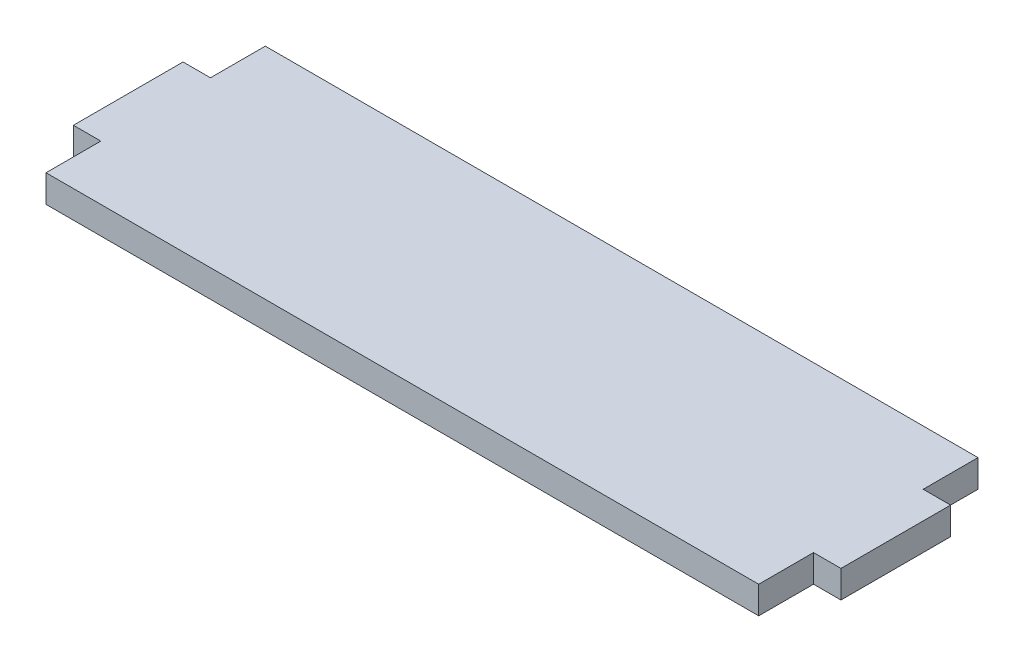
ISO-10303-21;
HEADER;
FILE_DESCRIPTION(('STEP AP214'),'2;1');
FILE_NAME('part.step','',(''),(''),'','','');
FILE_SCHEMA(('AUTOMOTIVE_DESIGN { 1 0 10303 214 1 1 1 1 }'));
ENDSEC;
DATA;
#1=APPLICATION_CONTEXT('core data for automotive mechanical design processes');
#2=APPLICATION_PROTOCOL_DEFINITION('international standard','automotive_design',2000,#1);
#3=PRODUCT_CONTEXT('',#1,'mechanical');
#4=PRODUCT('Part','Part','',(#3));
#5=PRODUCT_RELATED_PRODUCT_CATEGORY('part','',(#4));
#6=PRODUCT_DEFINITION_FORMATION('','',#4);
#7=PRODUCT_DEFINITION_CONTEXT('part definition',#1,'design');
#8=PRODUCT_DEFINITION('design','',#6,#7);
#9=PRODUCT_DEFINITION_SHAPE('','',#8);
#10=(LENGTH_UNIT() NAMED_UNIT(*) SI_UNIT(.MILLI.,.METRE.));
#11=(NAMED_UNIT(*) PLANE_ANGLE_UNIT() SI_UNIT($,.RADIAN.));
#12=(NAMED_UNIT(*) SI_UNIT($,.STERADIAN.) SOLID_ANGLE_UNIT());
#13=UNCERTAINTY_MEASURE_WITH_UNIT(LENGTH_MEASURE(1.E-05),#10,'distance_accuracy_value','');
#14=(GEOMETRIC_REPRESENTATION_CONTEXT(3) GLOBAL_UNCERTAINTY_ASSIGNED_CONTEXT((#13)) GLOBAL_UNIT_ASSIGNED_CONTEXT((#10,
#11,#12)) REPRESENTATION_CONTEXT('',''));
#15=CARTESIAN_POINT('',(0.,0.,0.));
#16=DIRECTION('',(0.,0.,1.));
#17=DIRECTION('',(1.,0.,0.));
#18=AXIS2_PLACEMENT_3D('',#15,#16,#17);
#19=CARTESIAN_POINT('',(41.275,3.175,-12.7));
#20=DIRECTION('',(-1.,0.,0.));
#21=DIRECTION('',(0.,0.,1.));
#22=AXIS2_PLACEMENT_3D('',#19,#20,#21);
#23=PLANE('',#22);
#24=DIRECTION('',(0.,0.,-1.));
#25=VECTOR('',#24,1.);
#26=CARTESIAN_POINT('',(41.275,0.,-12.7));
#27=LINE('',#26,#25);
#28=CARTESIAN_POINT('',(41.275,0.,-6.35));
#29=VERTEX_POINT('',#28);
#30=CARTESIAN_POINT('',(41.275,0.,-12.7));
#31=VERTEX_POINT('',#30);
#32=EDGE_CURVE('E153',#29,#31,#27,.T.);
#33=ORIENTED_EDGE('',*,*,#32,.T.);
#34=DIRECTION('',(0.,-1.,0.));
#35=VECTOR('',#34,1.);
#36=CARTESIAN_POINT('',(41.275,3.175,-12.7));
#37=LINE('',#36,#35);
#38=CARTESIAN_POINT('',(41.275,3.175,-12.7));
#39=VERTEX_POINT('',#38);
#40=EDGE_CURVE('E11',#39,#31,#37,.T.);
#41=ORIENTED_EDGE('',*,*,#40,.F.);
#42=DIRECTION('',(0.,0.,-1.));
#43=VECTOR('',#42,1.);
#44=CARTESIAN_POINT('',(41.275,3.175,-12.7));
#45=LINE('',#44,#43);
#46=CARTESIAN_POINT('',(41.275,3.175,-6.35));
#47=VERTEX_POINT('',#46);
#48=EDGE_CURVE('E175',#47,#39,#45,.T.);
#49=ORIENTED_EDGE('',*,*,#48,.F.);
#50=DIRECTION('',(0.,-1.,0.));
#51=VECTOR('',#50,1.);
#52=CARTESIAN_POINT('',(41.275,3.175,-6.35));
#53=LINE('',#52,#51);
#54=EDGE_CURVE('E149',#47,#29,#53,.T.);
#55=ORIENTED_EDGE('',*,*,#54,.T.);
#56=EDGE_LOOP('',(#33,#41,#49,#55));
#57=FACE_BOUND('',#56,.T.);
#58=ADVANCED_FACE('F33',(#57),#23,.F.);
#59=CARTESIAN_POINT('',(-41.275,3.175,-12.7));
#60=DIRECTION('',(0.,0.,1.));
#61=DIRECTION('',(1.,0.,0.));
#62=AXIS2_PLACEMENT_3D('',#59,#60,#61);
#63=PLANE('',#62);
#64=DIRECTION('',(-1.,0.,0.));
#65=VECTOR('',#64,1.);
#66=CARTESIAN_POINT('',(-41.275,0.,-12.7));
#67=LINE('',#66,#65);
#68=CARTESIAN_POINT('',(-41.275,0.,-12.7));
#69=VERTEX_POINT('',#68);
#70=EDGE_CURVE('E156',#31,#69,#67,.T.);
#71=ORIENTED_EDGE('',*,*,#70,.T.);
#72=DIRECTION('',(0.,-1.,0.));
#73=VECTOR('',#72,1.);
#74=CARTESIAN_POINT('',(-41.275,3.175,-12.7));
#75=LINE('',#74,#73);
#76=CARTESIAN_POINT('',(-41.275,3.175,-12.7));
#77=VERTEX_POINT('',#76);
#78=EDGE_CURVE('E41',#77,#69,#75,.T.);
#79=ORIENTED_EDGE('',*,*,#78,.F.);
#80=DIRECTION('',(-1.,0.,0.));
#81=VECTOR('',#80,1.);
#82=CARTESIAN_POINT('',(-41.275,3.175,-12.7));
#83=LINE('',#82,#81);
#84=EDGE_CURVE('E104',#39,#77,#83,.T.);
#85=ORIENTED_EDGE('',*,*,#84,.F.);
#86=ORIENTED_EDGE('',*,*,#40,.T.);
#87=EDGE_LOOP('',(#71,#79,#85,#86));
#88=FACE_BOUND('',#87,.T.);
#89=ADVANCED_FACE('F253',(#88),#63,.F.);
#90=CARTESIAN_POINT('',(-41.275,3.175,-12.7));
#91=DIRECTION('',(1.,0.,0.));
#92=DIRECTION('',(0.,0.,-1.));
#93=AXIS2_PLACEMENT_3D('',#90,#91,#92);
#94=PLANE('',#93);
#95=DIRECTION('',(0.,0.,1.));
#96=VECTOR('',#95,1.);
#97=CARTESIAN_POINT('',(-41.275,0.,-12.7));
#98=LINE('',#97,#96);
#99=CARTESIAN_POINT('',(-41.275,0.,-6.35));
#100=VERTEX_POINT('',#99);
#101=EDGE_CURVE('E158',#69,#100,#98,.T.);
#102=ORIENTED_EDGE('',*,*,#101,.T.);
#103=DIRECTION('',(0.,-1.,0.));
#104=VECTOR('',#103,1.);
#105=CARTESIAN_POINT('',(-41.275,3.175,-6.35));
#106=LINE('',#105,#104);
#107=CARTESIAN_POINT('',(-41.275,3.175,-6.35));
#108=VERTEX_POINT('',#107);
#109=EDGE_CURVE('E194',#108,#100,#106,.T.);
#110=ORIENTED_EDGE('',*,*,#109,.F.);
#111=DIRECTION('',(0.,0.,1.));
#112=VECTOR('',#111,1.);
#113=CARTESIAN_POINT('',(-41.275,3.175,-12.7));
#114=LINE('',#113,#112);
#115=EDGE_CURVE('E202',#77,#108,#114,.T.);
#116=ORIENTED_EDGE('',*,*,#115,.F.);
#117=ORIENTED_EDGE('',*,*,#78,.T.);
#118=EDGE_LOOP('',(#102,#110,#116,#117));
#119=FACE_BOUND('',#118,.T.);
#120=ADVANCED_FACE('F200',(#119),#94,.F.);
#121=CARTESIAN_POINT('',(-41.275,3.175,-6.35));
#122=DIRECTION('',(0.,0.,1.));
#123=DIRECTION('',(1.,0.,0.));
#124=AXIS2_PLACEMENT_3D('',#121,#122,#123);
#125=PLANE('',#124);
#126=DIRECTION('',(-1.,0.,0.));
#127=VECTOR('',#126,1.);
#128=CARTESIAN_POINT('',(-41.275,0.,-6.35));
#129=LINE('',#128,#127);
#130=CARTESIAN_POINT('',(-44.45,0.,-6.35));
#131=VERTEX_POINT('',#130);
#132=EDGE_CURVE('E160',#100,#131,#129,.T.);
#133=ORIENTED_EDGE('',*,*,#132,.T.);
#134=DIRECTION('',(0.,-1.,0.));
#135=VECTOR('',#134,1.);
#136=CARTESIAN_POINT('',(-44.45,3.175,-6.35));
#137=LINE('',#136,#135);
#138=CARTESIAN_POINT('',(-44.45,3.175,-6.35));
#139=VERTEX_POINT('',#138);
#140=EDGE_CURVE('E191',#139,#131,#137,.T.);
#141=ORIENTED_EDGE('',*,*,#140,.F.);
#142=DIRECTION('',(-1.,0.,0.));
#143=VECTOR('',#142,1.);
#144=CARTESIAN_POINT('',(-41.275,3.175,-6.35));
#145=LINE('',#144,#143);
#146=EDGE_CURVE('E220',#108,#139,#145,.T.);
#147=ORIENTED_EDGE('',*,*,#146,.F.);
#148=ORIENTED_EDGE('',*,*,#109,.T.);
#149=EDGE_LOOP('',(#133,#141,#147,#148));
#150=FACE_BOUND('',#149,.T.);
#151=ADVANCED_FACE('F211',(#150),#125,.F.);
#152=CARTESIAN_POINT('',(-44.45,3.175,-6.35));
#153=DIRECTION('',(1.,0.,0.));
#154=DIRECTION('',(0.,0.,-1.));
#155=AXIS2_PLACEMENT_3D('',#152,#153,#154);
#156=PLANE('',#155);
#157=DIRECTION('',(0.,0.,1.));
#158=VECTOR('',#157,1.);
#159=CARTESIAN_POINT('',(-44.45,0.,-6.35));
#160=LINE('',#159,#158);
#161=CARTESIAN_POINT('',(-44.45,0.,6.35));
#162=VERTEX_POINT('',#161);
#163=EDGE_CURVE('E162',#131,#162,#160,.T.);
#164=ORIENTED_EDGE('',*,*,#163,.T.);
#165=DIRECTION('',(0.,-1.,0.));
#166=VECTOR('',#165,1.);
#167=CARTESIAN_POINT('',(-44.45,3.175,6.35));
#168=LINE('',#167,#166);
#169=CARTESIAN_POINT('',(-44.45,3.175,6.35));
#170=VERTEX_POINT('',#169);
#171=EDGE_CURVE('E188',#170,#162,#168,.T.);
#172=ORIENTED_EDGE('',*,*,#171,.F.);
#173=DIRECTION('',(0.,0.,1.));
#174=VECTOR('',#173,1.);
#175=CARTESIAN_POINT('',(-44.45,3.175,-6.35));
#176=LINE('',#175,#174);
#177=EDGE_CURVE('E217',#139,#170,#176,.T.);
#178=ORIENTED_EDGE('',*,*,#177,.F.);
#179=ORIENTED_EDGE('',*,*,#140,.T.);
#180=EDGE_LOOP('',(#164,#172,#178,#179));
#181=FACE_BOUND('',#180,.T.);
#182=ADVANCED_FACE('F215',(#181),#156,.F.);
#183=CARTESIAN_POINT('',(-44.45,3.175,6.35));
#184=DIRECTION('',(0.,0.,-1.));
#185=DIRECTION('',(-1.,0.,0.));
#186=AXIS2_PLACEMENT_3D('',#183,#184,#185);
#187=PLANE('',#186);
#188=DIRECTION('',(1.,0.,0.));
#189=VECTOR('',#188,1.);
#190=CARTESIAN_POINT('',(-44.45,0.,6.35));
#191=LINE('',#190,#189);
#192=CARTESIAN_POINT('',(-41.275,0.,6.35));
#193=VERTEX_POINT('',#192);
#194=EDGE_CURVE('E164',#162,#193,#191,.T.);
#195=ORIENTED_EDGE('',*,*,#194,.T.);
#196=DIRECTION('',(0.,-1.,0.));
#197=VECTOR('',#196,1.);
#198=CARTESIAN_POINT('',(-41.275,3.175,6.35));
#199=LINE('',#198,#197);
#200=CARTESIAN_POINT('',(-41.275,3.175,6.35));
#201=VERTEX_POINT('',#200);
#202=EDGE_CURVE('E185',#201,#193,#199,.T.);
#203=ORIENTED_EDGE('',*,*,#202,.F.);
#204=DIRECTION('',(1.,0.,0.));
#205=VECTOR('',#204,1.);
#206=CARTESIAN_POINT('',(-44.45,3.175,6.35));
#207=LINE('',#206,#205);
#208=EDGE_CURVE('E219',#170,#201,#207,.T.);
#209=ORIENTED_EDGE('',*,*,#208,.F.);
#210=ORIENTED_EDGE('',*,*,#171,.T.);
#211=EDGE_LOOP('',(#195,#203,#209,#210));
#212=FACE_BOUND('',#211,.T.);
#213=ADVANCED_FACE('F266',(#212),#187,.F.);
#214=CARTESIAN_POINT('',(-41.275,3.175,6.35));
#215=DIRECTION('',(1.,0.,0.));
#216=DIRECTION('',(0.,0.,-1.));
#217=AXIS2_PLACEMENT_3D('',#214,#215,#216);
#218=PLANE('',#217);
#219=DIRECTION('',(0.,0.,1.));
#220=VECTOR('',#219,1.);
#221=CARTESIAN_POINT('',(-41.275,0.,6.35));
#222=LINE('',#221,#220);
#223=CARTESIAN_POINT('',(-41.275,0.,12.7));
#224=VERTEX_POINT('',#223);
#225=EDGE_CURVE('E166',#193,#224,#222,.T.);
#226=ORIENTED_EDGE('',*,*,#225,.T.);
#227=DIRECTION('',(0.,-1.,0.));
#228=VECTOR('',#227,1.);
#229=CARTESIAN_POINT('',(-41.275,3.175,12.7));
#230=LINE('',#229,#228);
#231=CARTESIAN_POINT('',(-41.275,3.175,12.7));
#232=VERTEX_POINT('',#231);
#233=EDGE_CURVE('E182',#232,#224,#230,.T.);
#234=ORIENTED_EDGE('',*,*,#233,.F.);
#235=DIRECTION('',(0.,0.,1.));
#236=VECTOR('',#235,1.);
#237=CARTESIAN_POINT('',(-41.275,3.175,6.35));
#238=LINE('',#237,#236);
#239=EDGE_CURVE('E222',#201,#232,#238,.T.);
#240=ORIENTED_EDGE('',*,*,#239,.F.);
#241=ORIENTED_EDGE('',*,*,#202,.T.);
#242=EDGE_LOOP('',(#226,#234,#240,#241));
#243=FACE_BOUND('',#242,.T.);
#244=ADVANCED_FACE('F269',(#243),#218,.F.);
#245=CARTESIAN_POINT('',(41.275,3.175,12.7));
#246=DIRECTION('',(0.,0.,-1.));
#247=DIRECTION('',(-1.,0.,0.));
#248=AXIS2_PLACEMENT_3D('',#245,#246,#247);
#249=PLANE('',#248);
#250=DIRECTION('',(1.,0.,0.));
#251=VECTOR('',#250,1.);
#252=CARTESIAN_POINT('',(41.275,0.,12.7));
#253=LINE('',#252,#251);
#254=CARTESIAN_POINT('',(41.275,0.,12.7));
#255=VERTEX_POINT('',#254);
#256=EDGE_CURVE('E168',#224,#255,#253,.T.);
#257=ORIENTED_EDGE('',*,*,#256,.T.);
#258=DIRECTION('',(0.,-1.,0.));
#259=VECTOR('',#258,1.);
#260=CARTESIAN_POINT('',(41.275,3.175,12.7));
#261=LINE('',#260,#259);
#262=CARTESIAN_POINT('',(41.275,3.175,12.7));
#263=VERTEX_POINT('',#262);
#264=EDGE_CURVE('E179',#263,#255,#261,.T.);
#265=ORIENTED_EDGE('',*,*,#264,.F.);
#266=DIRECTION('',(1.,0.,0.));
#267=VECTOR('',#266,1.);
#268=CARTESIAN_POINT('',(41.275,3.175,12.7));
#269=LINE('',#268,#267);
#270=EDGE_CURVE('E228',#232,#263,#269,.T.);
#271=ORIENTED_EDGE('',*,*,#270,.F.);
#272=ORIENTED_EDGE('',*,*,#233,.T.);
#273=EDGE_LOOP('',(#257,#265,#271,#272));
#274=FACE_BOUND('',#273,.T.);
#275=ADVANCED_FACE('F234',(#274),#249,.F.);
#276=CARTESIAN_POINT('',(41.275,3.175,6.35));
#277=DIRECTION('',(-1.,0.,0.));
#278=DIRECTION('',(0.,0.,1.));
#279=AXIS2_PLACEMENT_3D('',#276,#277,#278);
#280=PLANE('',#279);
#281=DIRECTION('',(0.,0.,-1.));
#282=VECTOR('',#281,1.);
#283=CARTESIAN_POINT('',(41.275,0.,6.35));
#284=LINE('',#283,#282);
#285=CARTESIAN_POINT('',(41.275,0.,6.35));
#286=VERTEX_POINT('',#285);
#287=EDGE_CURVE('E170',#255,#286,#284,.T.);
#288=ORIENTED_EDGE('',*,*,#287,.T.);
#289=DIRECTION('',(0.,-1.,0.));
#290=VECTOR('',#289,1.);
#291=CARTESIAN_POINT('',(41.275,3.175,6.35));
#292=LINE('',#291,#290);
#293=CARTESIAN_POINT('',(41.275,3.175,6.35));
#294=VERTEX_POINT('',#293);
#295=EDGE_CURVE('E144',#294,#286,#292,.T.);
#296=ORIENTED_EDGE('',*,*,#295,.F.);
#297=DIRECTION('',(0.,0.,-1.));
#298=VECTOR('',#297,1.);
#299=CARTESIAN_POINT('',(41.275,3.175,6.35));
#300=LINE('',#299,#298);
#301=EDGE_CURVE('E135',#263,#294,#300,.T.);
#302=ORIENTED_EDGE('',*,*,#301,.F.);
#303=ORIENTED_EDGE('',*,*,#264,.T.);
#304=EDGE_LOOP('',(#288,#296,#302,#303));
#305=FACE_BOUND('',#304,.T.);
#306=ADVANCED_FACE('F238',(#305),#280,.F.);
#307=CARTESIAN_POINT('',(44.45,3.175,6.35));
#308=DIRECTION('',(0.,0.,-1.));
#309=DIRECTION('',(-1.,0.,0.));
#310=AXIS2_PLACEMENT_3D('',#307,#308,#309);
#311=PLANE('',#310);
#312=DIRECTION('',(1.,0.,0.));
#313=VECTOR('',#312,1.);
#314=CARTESIAN_POINT('',(44.45,0.,6.35));
#315=LINE('',#314,#313);
#316=CARTESIAN_POINT('',(44.45,0.,6.35));
#317=VERTEX_POINT('',#316);
#318=EDGE_CURVE('E143',#286,#317,#315,.T.);
#319=ORIENTED_EDGE('',*,*,#318,.T.);
#320=DIRECTION('',(0.,-1.,0.));
#321=VECTOR('',#320,1.);
#322=CARTESIAN_POINT('',(44.45,3.175,6.35));
#323=LINE('',#322,#321);
#324=CARTESIAN_POINT('',(44.45,3.175,6.35));
#325=VERTEX_POINT('',#324);
#326=EDGE_CURVE('E140',#325,#317,#323,.T.);
#327=ORIENTED_EDGE('',*,*,#326,.F.);
#328=DIRECTION('',(1.,0.,0.));
#329=VECTOR('',#328,1.);
#330=CARTESIAN_POINT('',(44.45,3.175,6.35));
#331=LINE('',#330,#329);
#332=EDGE_CURVE('E129',#294,#325,#331,.T.);
#333=ORIENTED_EDGE('',*,*,#332,.F.);
#334=ORIENTED_EDGE('',*,*,#295,.T.);
#335=EDGE_LOOP('',(#319,#327,#333,#334));
#336=FACE_BOUND('',#335,.T.);
#337=ADVANCED_FACE('F141',(#336),#311,.F.);
#338=CARTESIAN_POINT('',(44.45,3.175,-6.35));
#339=DIRECTION('',(-1.,0.,0.));
#340=DIRECTION('',(0.,0.,1.));
#341=AXIS2_PLACEMENT_3D('',#338,#339,#340);
#342=PLANE('',#341);
#343=DIRECTION('',(0.,0.,-1.));
#344=VECTOR('',#343,1.);
#345=CARTESIAN_POINT('',(44.45,0.,-6.35));
#346=LINE('',#345,#344);
#347=CARTESIAN_POINT('',(44.45,0.,-6.35));
#348=VERTEX_POINT('',#347);
#349=EDGE_CURVE('E90',#317,#348,#346,.T.);
#350=ORIENTED_EDGE('',*,*,#349,.T.);
#351=DIRECTION('',(0.,-1.,0.));
#352=VECTOR('',#351,1.);
#353=CARTESIAN_POINT('',(44.45,3.175,-6.35));
#354=LINE('',#353,#352);
#355=CARTESIAN_POINT('',(44.45,3.175,-6.35));
#356=VERTEX_POINT('',#355);
#357=EDGE_CURVE('E145',#356,#348,#354,.T.);
#358=ORIENTED_EDGE('',*,*,#357,.F.);
#359=DIRECTION('',(0.,0.,-1.));
#360=VECTOR('',#359,1.);
#361=CARTESIAN_POINT('',(44.45,3.175,-6.35));
#362=LINE('',#361,#360);
#363=EDGE_CURVE('E133',#325,#356,#362,.T.);
#364=ORIENTED_EDGE('',*,*,#363,.F.);
#365=ORIENTED_EDGE('',*,*,#326,.T.);
#366=EDGE_LOOP('',(#350,#358,#364,#365));
#367=FACE_BOUND('',#366,.T.);
#368=ADVANCED_FACE('F147',(#367),#342,.F.);
#369=CARTESIAN_POINT('',(41.275,3.175,-6.35));
#370=DIRECTION('',(0.,0.,1.));
#371=DIRECTION('',(1.,0.,0.));
#372=AXIS2_PLACEMENT_3D('',#369,#370,#371);
#373=PLANE('',#372);
#374=DIRECTION('',(-1.,0.,0.));
#375=VECTOR('',#374,1.);
#376=CARTESIAN_POINT('',(41.275,0.,-6.35));
#377=LINE('',#376,#375);
#378=EDGE_CURVE('E96',#348,#29,#377,.T.);
#379=ORIENTED_EDGE('',*,*,#378,.T.);
#380=ORIENTED_EDGE('',*,*,#54,.F.);
#381=DIRECTION('',(-1.,0.,0.));
#382=VECTOR('',#381,1.);
#383=CARTESIAN_POINT('',(41.275,3.175,-6.35));
#384=LINE('',#383,#382);
#385=EDGE_CURVE('E49',#356,#47,#384,.T.);
#386=ORIENTED_EDGE('',*,*,#385,.F.);
#387=ORIENTED_EDGE('',*,*,#357,.T.);
#388=EDGE_LOOP('',(#379,#380,#386,#387));
#389=FACE_BOUND('',#388,.T.);
#390=ADVANCED_FACE('F242',(#389),#373,.F.);
#391=CARTESIAN_POINT('',(0.,3.175,0.));
#392=DIRECTION('',(0.,1.,0.));
#393=DIRECTION('',(0.,0.,1.));
#394=AXIS2_PLACEMENT_3D('',#391,#392,#393);
#395=PLANE('',#394);
#396=ORIENTED_EDGE('',*,*,#48,.T.);
#397=ORIENTED_EDGE('',*,*,#84,.T.);
#398=ORIENTED_EDGE('',*,*,#115,.T.);
#399=ORIENTED_EDGE('',*,*,#146,.T.);
#400=ORIENTED_EDGE('',*,*,#177,.T.);
#401=ORIENTED_EDGE('',*,*,#208,.T.);
#402=ORIENTED_EDGE('',*,*,#239,.T.);
#403=ORIENTED_EDGE('',*,*,#270,.T.);
#404=ORIENTED_EDGE('',*,*,#301,.T.);
#405=ORIENTED_EDGE('',*,*,#332,.T.);
#406=ORIENTED_EDGE('',*,*,#363,.T.);
#407=ORIENTED_EDGE('',*,*,#385,.T.);
#408=EDGE_LOOP('',(#396,#397,#398,#399,#400,#401,#402,#403,#404,#405,#406,#407));
#409=FACE_BOUND('',#408,.T.);
#410=ADVANCED_FACE('F131',(#409),#395,.T.);
#411=CARTESIAN_POINT('',(0.,0.,0.));
#412=DIRECTION('',(0.,1.,0.));
#413=DIRECTION('',(0.,0.,1.));
#414=AXIS2_PLACEMENT_3D('',#411,#412,#413);
#415=PLANE('',#414);
#416=ORIENTED_EDGE('',*,*,#32,.F.);
#417=ORIENTED_EDGE('',*,*,#378,.F.);
#418=ORIENTED_EDGE('',*,*,#349,.F.);
#419=ORIENTED_EDGE('',*,*,#318,.F.);
#420=ORIENTED_EDGE('',*,*,#287,.F.);
#421=ORIENTED_EDGE('',*,*,#256,.F.);
#422=ORIENTED_EDGE('',*,*,#225,.F.);
#423=ORIENTED_EDGE('',*,*,#194,.F.);
#424=ORIENTED_EDGE('',*,*,#163,.F.);
#425=ORIENTED_EDGE('',*,*,#132,.F.);
#426=ORIENTED_EDGE('',*,*,#101,.F.);
#427=ORIENTED_EDGE('',*,*,#70,.F.);
#428=EDGE_LOOP('',(#416,#417,#418,#419,#420,#421,#422,#423,#424,#425,#426,#427));
#429=FACE_BOUND('',#428,.T.);
#430=ADVANCED_FACE('F206',(#429),#415,.F.);
#431=CLOSED_SHELL('',(#58,#89,#120,#151,#182,#213,#244,#275,#306,#337,#368,#390,#410,#430));
#432=MANIFOLD_SOLID_BREP('B2',#431);
#433=ADVANCED_BREP_SHAPE_REPRESENTATION('',(#18,#432),#14);
#434=SHAPE_DEFINITION_REPRESENTATION(#9,#433);
ENDSEC;
END-ISO-10303-21;
